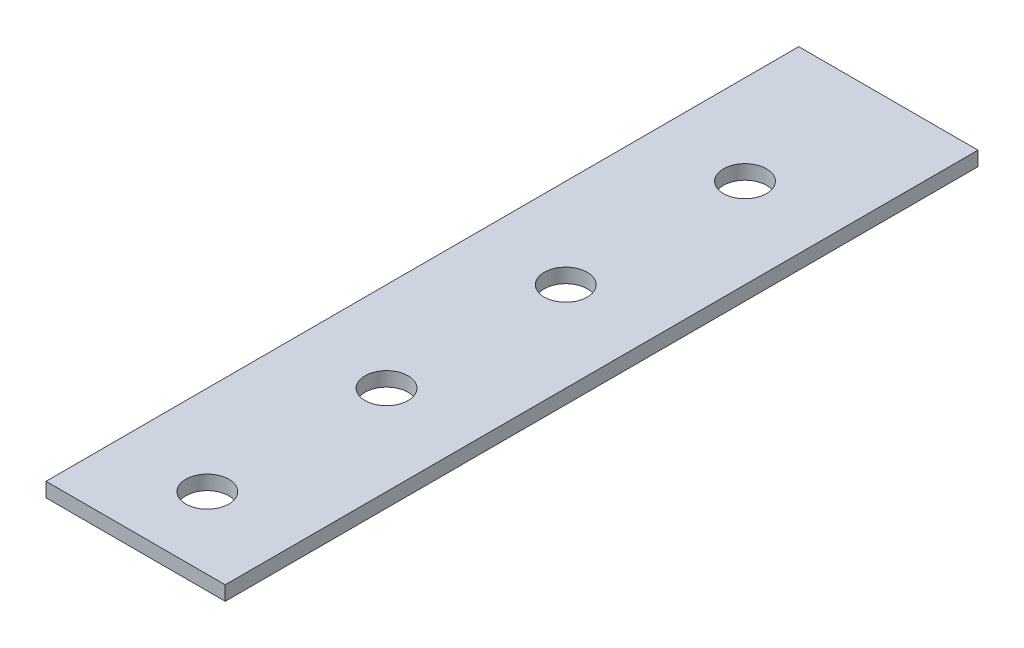
ISO-10303-21;
HEADER;
FILE_DESCRIPTION(('STEP AP214'),'2;1');
FILE_NAME('part.step','',(''),(''),'','','');
FILE_SCHEMA(('AUTOMOTIVE_DESIGN { 1 0 10303 214 1 1 1 1 }'));
ENDSEC;
DATA;
#1=APPLICATION_CONTEXT('core data for automotive mechanical design processes');
#2=APPLICATION_PROTOCOL_DEFINITION('international standard','automotive_design',2000,#1);
#3=PRODUCT_CONTEXT('',#1,'mechanical');
#4=PRODUCT('Part','Part','',(#3));
#5=PRODUCT_RELATED_PRODUCT_CATEGORY('part','',(#4));
#6=PRODUCT_DEFINITION_FORMATION('','',#4);
#7=PRODUCT_DEFINITION_CONTEXT('part definition',#1,'design');
#8=PRODUCT_DEFINITION('design','',#6,#7);
#9=PRODUCT_DEFINITION_SHAPE('','',#8);
#10=(LENGTH_UNIT() NAMED_UNIT(*) SI_UNIT(.MILLI.,.METRE.));
#11=(NAMED_UNIT(*) PLANE_ANGLE_UNIT() SI_UNIT($,.RADIAN.));
#12=(NAMED_UNIT(*) SI_UNIT($,.STERADIAN.) SOLID_ANGLE_UNIT());
#13=UNCERTAINTY_MEASURE_WITH_UNIT(LENGTH_MEASURE(1.E-05),#10,'distance_accuracy_value','');
#14=(GEOMETRIC_REPRESENTATION_CONTEXT(3) GLOBAL_UNCERTAINTY_ASSIGNED_CONTEXT((#13)) GLOBAL_UNIT_ASSIGNED_CONTEXT((#10,
#11,#12)) REPRESENTATION_CONTEXT('',''));
#15=CARTESIAN_POINT('',(0.,0.,0.));
#16=DIRECTION('',(0.,0.,1.));
#17=DIRECTION('',(1.,0.,0.));
#18=AXIS2_PLACEMENT_3D('',#15,#16,#17);
#19=CARTESIAN_POINT('',(12.5,2.,52.5));
#20=DIRECTION('',(-1.,0.,0.));
#21=DIRECTION('',(0.,0.,1.));
#22=AXIS2_PLACEMENT_3D('',#19,#20,#21);
#23=PLANE('',#22);
#24=DIRECTION('',(0.,0.,-1.));
#25=VECTOR('',#24,1.);
#26=CARTESIAN_POINT('',(12.5,0.,52.5));
#27=LINE('',#26,#25);
#28=CARTESIAN_POINT('',(12.5,0.,52.5));
#29=VERTEX_POINT('',#28);
#30=CARTESIAN_POINT('',(12.5,0.,-52.5));
#31=VERTEX_POINT('',#30);
#32=EDGE_CURVE('E96',#29,#31,#27,.T.);
#33=ORIENTED_EDGE('',*,*,#32,.T.);
#34=DIRECTION('',(0.,-1.,0.));
#35=VECTOR('',#34,1.);
#36=CARTESIAN_POINT('',(12.5,2.,-52.5));
#37=LINE('',#36,#35);
#38=CARTESIAN_POINT('',(12.5,2.,-52.5));
#39=VERTEX_POINT('',#38);
#40=EDGE_CURVE('E11',#39,#31,#37,.T.);
#41=ORIENTED_EDGE('',*,*,#40,.F.);
#42=DIRECTION('',(0.,0.,-1.));
#43=VECTOR('',#42,1.);
#44=CARTESIAN_POINT('',(12.5,2.,52.5));
#45=LINE('',#44,#43);
#46=CARTESIAN_POINT('',(12.5,2.,52.5));
#47=VERTEX_POINT('',#46);
#48=EDGE_CURVE('E84',#47,#39,#45,.T.);
#49=ORIENTED_EDGE('',*,*,#48,.F.);
#50=DIRECTION('',(0.,-1.,0.));
#51=VECTOR('',#50,1.);
#52=CARTESIAN_POINT('',(12.5,2.,52.5));
#53=LINE('',#52,#51);
#54=EDGE_CURVE('E92',#47,#29,#53,.T.);
#55=ORIENTED_EDGE('',*,*,#54,.T.);
#56=EDGE_LOOP('',(#33,#41,#49,#55));
#57=FACE_BOUND('',#56,.T.);
#58=ADVANCED_FACE('F33',(#57),#23,.F.);
#59=CARTESIAN_POINT('',(-12.5,2.,-52.5));
#60=DIRECTION('',(0.,0.,1.));
#61=DIRECTION('',(1.,0.,0.));
#62=AXIS2_PLACEMENT_3D('',#59,#60,#61);
#63=PLANE('',#62);
#64=DIRECTION('',(-1.,0.,0.));
#65=VECTOR('',#64,1.);
#66=CARTESIAN_POINT('',(-12.5,0.,-52.5));
#67=LINE('',#66,#65);
#68=CARTESIAN_POINT('',(-12.5,0.,-52.5));
#69=VERTEX_POINT('',#68);
#70=EDGE_CURVE('E88',#31,#69,#67,.T.);
#71=ORIENTED_EDGE('',*,*,#70,.T.);
#72=DIRECTION('',(0.,-1.,0.));
#73=VECTOR('',#72,1.);
#74=CARTESIAN_POINT('',(-12.5,2.,-52.5));
#75=LINE('',#74,#73);
#76=CARTESIAN_POINT('',(-12.5,2.,-52.5));
#77=VERTEX_POINT('',#76);
#78=EDGE_CURVE('E41',#77,#69,#75,.T.);
#79=ORIENTED_EDGE('',*,*,#78,.F.);
#80=DIRECTION('',(-1.,0.,0.));
#81=VECTOR('',#80,1.);
#82=CARTESIAN_POINT('',(-12.5,2.,-52.5));
#83=LINE('',#82,#81);
#84=EDGE_CURVE('E79',#39,#77,#83,.T.);
#85=ORIENTED_EDGE('',*,*,#84,.F.);
#86=ORIENTED_EDGE('',*,*,#40,.T.);
#87=EDGE_LOOP('',(#71,#79,#85,#86));
#88=FACE_BOUND('',#87,.T.);
#89=ADVANCED_FACE('F87',(#88),#63,.F.);
#90=CARTESIAN_POINT('',(-12.5,2.,52.5));
#91=DIRECTION('',(1.,0.,0.));
#92=DIRECTION('',(0.,0.,-1.));
#93=AXIS2_PLACEMENT_3D('',#90,#91,#92);
#94=PLANE('',#93);
#95=DIRECTION('',(0.,0.,1.));
#96=VECTOR('',#95,1.);
#97=CARTESIAN_POINT('',(-12.5,0.,52.5));
#98=LINE('',#97,#96);
#99=CARTESIAN_POINT('',(-12.5,0.,52.5));
#100=VERTEX_POINT('',#99);
#101=EDGE_CURVE('E66',#69,#100,#98,.T.);
#102=ORIENTED_EDGE('',*,*,#101,.T.);
#103=DIRECTION('',(0.,-1.,0.));
#104=VECTOR('',#103,1.);
#105=CARTESIAN_POINT('',(-12.5,2.,52.5));
#106=LINE('',#105,#104);
#107=CARTESIAN_POINT('',(-12.5,2.,52.5));
#108=VERTEX_POINT('',#107);
#109=EDGE_CURVE('E89',#108,#100,#106,.T.);
#110=ORIENTED_EDGE('',*,*,#109,.F.);
#111=DIRECTION('',(0.,0.,1.));
#112=VECTOR('',#111,1.);
#113=CARTESIAN_POINT('',(-12.5,2.,52.5));
#114=LINE('',#113,#112);
#115=EDGE_CURVE('E82',#77,#108,#114,.T.);
#116=ORIENTED_EDGE('',*,*,#115,.F.);
#117=ORIENTED_EDGE('',*,*,#78,.T.);
#118=EDGE_LOOP('',(#102,#110,#116,#117));
#119=FACE_BOUND('',#118,.T.);
#120=ADVANCED_FACE('F90',(#119),#94,.F.);
#121=CARTESIAN_POINT('',(-12.5,2.,52.5));
#122=DIRECTION('',(0.,0.,-1.));
#123=DIRECTION('',(-1.,0.,0.));
#124=AXIS2_PLACEMENT_3D('',#121,#122,#123);
#125=PLANE('',#124);
#126=DIRECTION('',(1.,0.,0.));
#127=VECTOR('',#126,1.);
#128=CARTESIAN_POINT('',(-12.5,0.,52.5));
#129=LINE('',#128,#127);
#130=EDGE_CURVE('E72',#100,#29,#129,.T.);
#131=ORIENTED_EDGE('',*,*,#130,.T.);
#132=ORIENTED_EDGE('',*,*,#54,.F.);
#133=DIRECTION('',(1.,0.,0.));
#134=VECTOR('',#133,1.);
#135=CARTESIAN_POINT('',(-12.5,2.,52.5));
#136=LINE('',#135,#134);
#137=EDGE_CURVE('E49',#108,#47,#136,.T.);
#138=ORIENTED_EDGE('',*,*,#137,.F.);
#139=ORIENTED_EDGE('',*,*,#109,.T.);
#140=EDGE_LOOP('',(#131,#132,#138,#139));
#141=FACE_BOUND('',#140,.T.);
#142=ADVANCED_FACE('F104',(#141),#125,.F.);
#143=CARTESIAN_POINT('',(0.,2.,0.));
#144=DIRECTION('',(0.,-1.,0.));
#145=DIRECTION('',(0.,0.,-1.));
#146=AXIS2_PLACEMENT_3D('',#143,#144,#145);
#147=PLANE('',#146);
#148=CARTESIAN_POINT('',(0.,2.,42.5));
#149=DIRECTION('',(0.,1.,0.));
#150=DIRECTION('',(0.,0.,1.));
#151=AXIS2_PLACEMENT_3D('',#148,#149,#150);
#152=CIRCLE('',#151,3.);
#153=CARTESIAN_POINT('',(0.,2.,45.5));
#154=VERTEX_POINT('',#153);
#155=EDGE_CURVE('E128',#154,#154,#152,.T.);
#156=ORIENTED_EDGE('',*,*,#155,.F.);
#157=EDGE_LOOP('',(#156));
#158=FACE_BOUND('',#157,.T.);
#159=CARTESIAN_POINT('',(0.,2.,17.5));
#160=DIRECTION('',(0.,1.,0.));
#161=DIRECTION('',(0.,0.,1.));
#162=AXIS2_PLACEMENT_3D('',#159,#160,#161);
#163=CIRCLE('',#162,3.);
#164=CARTESIAN_POINT('',(0.,2.,20.5));
#165=VERTEX_POINT('',#164);
#166=EDGE_CURVE('E122',#165,#165,#163,.T.);
#167=ORIENTED_EDGE('',*,*,#166,.F.);
#168=EDGE_LOOP('',(#167));
#169=FACE_BOUND('',#168,.T.);
#170=CARTESIAN_POINT('',(0.,2.,-7.49999999999999));
#171=DIRECTION('',(0.,1.,0.));
#172=DIRECTION('',(0.,0.,1.));
#173=AXIS2_PLACEMENT_3D('',#170,#171,#172);
#174=CIRCLE('',#173,3.);
#175=CARTESIAN_POINT('',(0.,2.,-4.49999999999998));
#176=VERTEX_POINT('',#175);
#177=EDGE_CURVE('E116',#176,#176,#174,.T.);
#178=ORIENTED_EDGE('',*,*,#177,.F.);
#179=EDGE_LOOP('',(#178));
#180=FACE_BOUND('',#179,.T.);
#181=CARTESIAN_POINT('',(0.,2.,-32.5));
#182=DIRECTION('',(0.,1.,0.));
#183=DIRECTION('',(0.,0.,1.));
#184=AXIS2_PLACEMENT_3D('',#181,#182,#183);
#185=CIRCLE('',#184,3.);
#186=CARTESIAN_POINT('',(0.,2.,-29.5));
#187=VERTEX_POINT('',#186);
#188=EDGE_CURVE('E110',#187,#187,#185,.T.);
#189=ORIENTED_EDGE('',*,*,#188,.F.);
#190=EDGE_LOOP('',(#189));
#191=FACE_BOUND('',#190,.T.);
#192=ORIENTED_EDGE('',*,*,#48,.T.);
#193=ORIENTED_EDGE('',*,*,#84,.T.);
#194=ORIENTED_EDGE('',*,*,#115,.T.);
#195=ORIENTED_EDGE('',*,*,#137,.T.);
#196=EDGE_LOOP('',(#192,#193,#194,#195));
#197=FACE_BOUND('',#196,.T.);
#198=ADVANCED_FACE('F80',(#158,#169,#180,#191,#197),#147,.F.);
#199=CARTESIAN_POINT('',(0.,0.,0.));
#200=DIRECTION('',(0.,-1.,0.));
#201=DIRECTION('',(0.,0.,-1.));
#202=AXIS2_PLACEMENT_3D('',#199,#200,#201);
#203=PLANE('',#202);
#204=CARTESIAN_POINT('',(0.,0.,42.5));
#205=DIRECTION('',(0.,1.,0.));
#206=DIRECTION('',(0.,0.,1.));
#207=AXIS2_PLACEMENT_3D('',#204,#205,#206);
#208=CIRCLE('',#207,3.);
#209=CARTESIAN_POINT('',(0.,0.,45.5));
#210=VERTEX_POINT('',#209);
#211=EDGE_CURVE('E99',#210,#210,#208,.T.);
#212=ORIENTED_EDGE('',*,*,#211,.T.);
#213=EDGE_LOOP('',(#212));
#214=FACE_BOUND('',#213,.T.);
#215=CARTESIAN_POINT('',(0.,0.,17.5));
#216=DIRECTION('',(0.,1.,0.));
#217=DIRECTION('',(0.,0.,1.));
#218=AXIS2_PLACEMENT_3D('',#215,#216,#217);
#219=CIRCLE('',#218,3.);
#220=CARTESIAN_POINT('',(0.,0.,20.5));
#221=VERTEX_POINT('',#220);
#222=EDGE_CURVE('E125',#221,#221,#219,.T.);
#223=ORIENTED_EDGE('',*,*,#222,.T.);
#224=EDGE_LOOP('',(#223));
#225=FACE_BOUND('',#224,.T.);
#226=CARTESIAN_POINT('',(0.,0.,-7.49999999999999));
#227=DIRECTION('',(0.,1.,0.));
#228=DIRECTION('',(0.,0.,1.));
#229=AXIS2_PLACEMENT_3D('',#226,#227,#228);
#230=CIRCLE('',#229,3.);
#231=CARTESIAN_POINT('',(0.,0.,-4.49999999999998));
#232=VERTEX_POINT('',#231);
#233=EDGE_CURVE('E119',#232,#232,#230,.T.);
#234=ORIENTED_EDGE('',*,*,#233,.T.);
#235=EDGE_LOOP('',(#234));
#236=FACE_BOUND('',#235,.T.);
#237=CARTESIAN_POINT('',(0.,0.,-32.5));
#238=DIRECTION('',(0.,1.,0.));
#239=DIRECTION('',(0.,0.,1.));
#240=AXIS2_PLACEMENT_3D('',#237,#238,#239);
#241=CIRCLE('',#240,3.);
#242=CARTESIAN_POINT('',(0.,0.,-29.5));
#243=VERTEX_POINT('',#242);
#244=EDGE_CURVE('E113',#243,#243,#241,.T.);
#245=ORIENTED_EDGE('',*,*,#244,.T.);
#246=EDGE_LOOP('',(#245));
#247=FACE_BOUND('',#246,.T.);
#248=ORIENTED_EDGE('',*,*,#32,.F.);
#249=ORIENTED_EDGE('',*,*,#130,.F.);
#250=ORIENTED_EDGE('',*,*,#101,.F.);
#251=ORIENTED_EDGE('',*,*,#70,.F.);
#252=EDGE_LOOP('',(#248,#249,#250,#251));
#253=FACE_BOUND('',#252,.T.);
#254=ADVANCED_FACE('F107',(#214,#225,#236,#247,#253),#203,.T.);
#255=CARTESIAN_POINT('',(0.,0.,-32.5));
#256=DIRECTION('',(0.,1.,0.));
#257=DIRECTION('',(0.,0.,1.));
#258=AXIS2_PLACEMENT_3D('',#255,#256,#257);
#259=CYLINDRICAL_SURFACE('',#258,3.);
#260=ORIENTED_EDGE('',*,*,#244,.F.);
#261=EDGE_LOOP('',(#260));
#262=FACE_BOUND('',#261,.T.);
#263=ORIENTED_EDGE('',*,*,#188,.T.);
#264=EDGE_LOOP('',(#263));
#265=FACE_BOUND('',#264,.T.);
#266=ADVANCED_FACE('F152',(#262,#265),#259,.F.);
#267=CARTESIAN_POINT('',(0.,0.,-7.49999999999999));
#268=DIRECTION('',(0.,1.,0.));
#269=DIRECTION('',(0.,0.,1.));
#270=AXIS2_PLACEMENT_3D('',#267,#268,#269);
#271=CYLINDRICAL_SURFACE('',#270,3.);
#272=ORIENTED_EDGE('',*,*,#233,.F.);
#273=EDGE_LOOP('',(#272));
#274=FACE_BOUND('',#273,.T.);
#275=ORIENTED_EDGE('',*,*,#177,.T.);
#276=EDGE_LOOP('',(#275));
#277=FACE_BOUND('',#276,.T.);
#278=ADVANCED_FACE('F154',(#274,#277),#271,.F.);
#279=CARTESIAN_POINT('',(0.,0.,17.5));
#280=DIRECTION('',(0.,1.,0.));
#281=DIRECTION('',(0.,0.,1.));
#282=AXIS2_PLACEMENT_3D('',#279,#280,#281);
#283=CYLINDRICAL_SURFACE('',#282,3.);
#284=ORIENTED_EDGE('',*,*,#222,.F.);
#285=EDGE_LOOP('',(#284));
#286=FACE_BOUND('',#285,.T.);
#287=ORIENTED_EDGE('',*,*,#166,.T.);
#288=EDGE_LOOP('',(#287));
#289=FACE_BOUND('',#288,.T.);
#290=ADVANCED_FACE('F139',(#286,#289),#283,.F.);
#291=CARTESIAN_POINT('',(0.,0.,42.5));
#292=DIRECTION('',(0.,1.,0.));
#293=DIRECTION('',(0.,0.,1.));
#294=AXIS2_PLACEMENT_3D('',#291,#292,#293);
#295=CYLINDRICAL_SURFACE('',#294,3.);
#296=ORIENTED_EDGE('',*,*,#211,.F.);
#297=EDGE_LOOP('',(#296));
#298=FACE_BOUND('',#297,.T.);
#299=ORIENTED_EDGE('',*,*,#155,.T.);
#300=EDGE_LOOP('',(#299));
#301=FACE_BOUND('',#300,.T.);
#302=ADVANCED_FACE('F136',(#298,#301),#295,.F.);
#303=CLOSED_SHELL('',(#58,#89,#120,#142,#198,#254,#266,#278,#290,#302));
#304=MANIFOLD_SOLID_BREP('B2',#303);
#305=ADVANCED_BREP_SHAPE_REPRESENTATION('',(#18,#304),#14);
#306=SHAPE_DEFINITION_REPRESENTATION(#9,#305);
ENDSEC;
END-ISO-10303-21;
